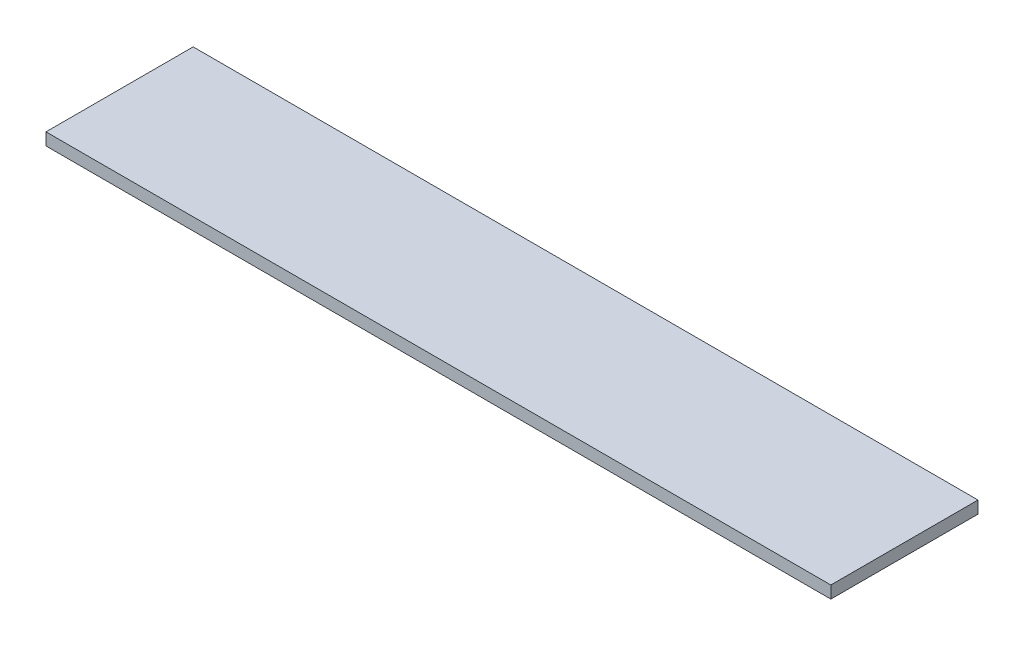
ISO-10303-21;
HEADER;
FILE_DESCRIPTION(('STEP AP214'),'2;1');
FILE_NAME('part.step','',(''),(''),'','','');
FILE_SCHEMA(('AUTOMOTIVE_DESIGN { 1 0 10303 214 1 1 1 1 }'));
ENDSEC;
DATA;
#1=APPLICATION_CONTEXT('core data for automotive mechanical design processes');
#2=APPLICATION_PROTOCOL_DEFINITION('international standard','automotive_design',2000,#1);
#3=PRODUCT_CONTEXT('',#1,'mechanical');
#4=PRODUCT('Part','Part','',(#3));
#5=PRODUCT_RELATED_PRODUCT_CATEGORY('part','',(#4));
#6=PRODUCT_DEFINITION_FORMATION('','',#4);
#7=PRODUCT_DEFINITION_CONTEXT('part definition',#1,'design');
#8=PRODUCT_DEFINITION('design','',#6,#7);
#9=PRODUCT_DEFINITION_SHAPE('','',#8);
#10=(LENGTH_UNIT() NAMED_UNIT(*) SI_UNIT(.MILLI.,.METRE.));
#11=(NAMED_UNIT(*) PLANE_ANGLE_UNIT() SI_UNIT($,.RADIAN.));
#12=(NAMED_UNIT(*) SI_UNIT($,.STERADIAN.) SOLID_ANGLE_UNIT());
#13=UNCERTAINTY_MEASURE_WITH_UNIT(LENGTH_MEASURE(1.E-05),#10,'distance_accuracy_value','');
#14=(GEOMETRIC_REPRESENTATION_CONTEXT(3) GLOBAL_UNCERTAINTY_ASSIGNED_CONTEXT((#13)) GLOBAL_UNIT_ASSIGNED_CONTEXT((#10,
#11,#12)) REPRESENTATION_CONTEXT('',''));
#15=CARTESIAN_POINT('',(0.,0.,0.));
#16=DIRECTION('',(0.,0.,1.));
#17=DIRECTION('',(1.,0.,0.));
#18=AXIS2_PLACEMENT_3D('',#15,#16,#17);
#19=CARTESIAN_POINT('',(0.,5.,0.));
#20=DIRECTION('',(1.,0.,0.));
#21=DIRECTION('',(0.,0.,-1.));
#22=AXIS2_PLACEMENT_3D('',#19,#20,#21);
#23=PLANE('',#22);
#24=DIRECTION('',(0.,0.,1.));
#25=VECTOR('',#24,1.);
#26=CARTESIAN_POINT('',(0.,0.,0.));
#27=LINE('',#26,#25);
#28=CARTESIAN_POINT('',(0.,0.,0.));
#29=VERTEX_POINT('',#28);
#30=CARTESIAN_POINT('',(0.,0.,60.));
#31=VERTEX_POINT('',#30);
#32=EDGE_CURVE('E111',#29,#31,#27,.T.);
#33=ORIENTED_EDGE('',*,*,#32,.T.);
#34=DIRECTION('',(0.,-1.,0.));
#35=VECTOR('',#34,1.);
#36=CARTESIAN_POINT('',(0.,5.,60.));
#37=LINE('',#36,#35);
#38=CARTESIAN_POINT('',(0.,5.,60.));
#39=VERTEX_POINT('',#38);
#40=EDGE_CURVE('E11',#39,#31,#37,.T.);
#41=ORIENTED_EDGE('',*,*,#40,.F.);
#42=DIRECTION('',(0.,0.,1.));
#43=VECTOR('',#42,1.);
#44=CARTESIAN_POINT('',(0.,5.,0.));
#45=LINE('',#44,#43);
#46=CARTESIAN_POINT('',(0.,5.,0.));
#47=VERTEX_POINT('',#46);
#48=EDGE_CURVE('E95',#47,#39,#45,.T.);
#49=ORIENTED_EDGE('',*,*,#48,.F.);
#50=DIRECTION('',(0.,-1.,0.));
#51=VECTOR('',#50,1.);
#52=CARTESIAN_POINT('',(0.,5.,0.));
#53=LINE('',#52,#51);
#54=EDGE_CURVE('E107',#47,#29,#53,.T.);
#55=ORIENTED_EDGE('',*,*,#54,.T.);
#56=EDGE_LOOP('',(#33,#41,#49,#55));
#57=FACE_BOUND('',#56,.T.);
#58=ADVANCED_FACE('F43',(#57),#23,.F.);
#59=CARTESIAN_POINT('',(0.,5.,60.));
#60=DIRECTION('',(0.,0.,-1.));
#61=DIRECTION('',(-1.,0.,0.));
#62=AXIS2_PLACEMENT_3D('',#59,#60,#61);
#63=PLANE('',#62);
#64=DIRECTION('',(1.,0.,0.));
#65=VECTOR('',#64,1.);
#66=CARTESIAN_POINT('',(0.,0.,60.));
#67=LINE('',#66,#65);
#68=CARTESIAN_POINT('',(320.,0.,60.));
#69=VERTEX_POINT('',#68);
#70=EDGE_CURVE('E100',#31,#69,#67,.T.);
#71=ORIENTED_EDGE('',*,*,#70,.T.);
#72=DIRECTION('',(0.,-1.,0.));
#73=VECTOR('',#72,1.);
#74=CARTESIAN_POINT('',(320.,5.,60.));
#75=LINE('',#74,#73);
#76=CARTESIAN_POINT('',(320.,5.,60.));
#77=VERTEX_POINT('',#76);
#78=EDGE_CURVE('E52',#77,#69,#75,.T.);
#79=ORIENTED_EDGE('',*,*,#78,.F.);
#80=DIRECTION('',(1.,0.,0.));
#81=VECTOR('',#80,1.);
#82=CARTESIAN_POINT('',(0.,5.,60.));
#83=LINE('',#82,#81);
#84=EDGE_CURVE('E90',#39,#77,#83,.T.);
#85=ORIENTED_EDGE('',*,*,#84,.F.);
#86=ORIENTED_EDGE('',*,*,#40,.T.);
#87=EDGE_LOOP('',(#71,#79,#85,#86));
#88=FACE_BOUND('',#87,.T.);
#89=ADVANCED_FACE('F99',(#88),#63,.F.);
#90=CARTESIAN_POINT('',(320.,5.,0.));
#91=DIRECTION('',(-1.,0.,0.));
#92=DIRECTION('',(0.,0.,1.));
#93=AXIS2_PLACEMENT_3D('',#90,#91,#92);
#94=PLANE('',#93);
#95=DIRECTION('',(0.,0.,-1.));
#96=VECTOR('',#95,1.);
#97=CARTESIAN_POINT('',(320.,0.,0.));
#98=LINE('',#97,#96);
#99=CARTESIAN_POINT('',(320.,0.,0.));
#100=VERTEX_POINT('',#99);
#101=EDGE_CURVE('E77',#69,#100,#98,.T.);
#102=ORIENTED_EDGE('',*,*,#101,.T.);
#103=DIRECTION('',(0.,-1.,0.));
#104=VECTOR('',#103,1.);
#105=CARTESIAN_POINT('',(320.,5.,0.));
#106=LINE('',#105,#104);
#107=CARTESIAN_POINT('',(320.,5.,0.));
#108=VERTEX_POINT('',#107);
#109=EDGE_CURVE('E102',#108,#100,#106,.T.);
#110=ORIENTED_EDGE('',*,*,#109,.F.);
#111=DIRECTION('',(0.,0.,-1.));
#112=VECTOR('',#111,1.);
#113=CARTESIAN_POINT('',(320.,5.,0.));
#114=LINE('',#113,#112);
#115=EDGE_CURVE('E93',#77,#108,#114,.T.);
#116=ORIENTED_EDGE('',*,*,#115,.F.);
#117=ORIENTED_EDGE('',*,*,#78,.T.);
#118=EDGE_LOOP('',(#102,#110,#116,#117));
#119=FACE_BOUND('',#118,.T.);
#120=ADVANCED_FACE('F103',(#119),#94,.F.);
#121=CARTESIAN_POINT('',(0.,5.,0.));
#122=DIRECTION('',(0.,0.,1.));
#123=DIRECTION('',(1.,0.,0.));
#124=AXIS2_PLACEMENT_3D('',#121,#122,#123);
#125=PLANE('',#124);
#126=DIRECTION('',(-1.,0.,0.));
#127=VECTOR('',#126,1.);
#128=CARTESIAN_POINT('',(0.,0.,0.));
#129=LINE('',#128,#127);
#130=EDGE_CURVE('E83',#100,#29,#129,.T.);
#131=ORIENTED_EDGE('',*,*,#130,.T.);
#132=ORIENTED_EDGE('',*,*,#54,.F.);
#133=DIRECTION('',(-1.,0.,0.));
#134=VECTOR('',#133,1.);
#135=CARTESIAN_POINT('',(0.,5.,0.));
#136=LINE('',#135,#134);
#137=EDGE_CURVE('E60',#108,#47,#136,.T.);
#138=ORIENTED_EDGE('',*,*,#137,.F.);
#139=ORIENTED_EDGE('',*,*,#109,.T.);
#140=EDGE_LOOP('',(#131,#132,#138,#139));
#141=FACE_BOUND('',#140,.T.);
#142=ADVANCED_FACE('F124',(#141),#125,.F.);
#143=CARTESIAN_POINT('',(0.,5.,0.));
#144=DIRECTION('',(0.,1.,0.));
#145=DIRECTION('',(0.,0.,1.));
#146=AXIS2_PLACEMENT_3D('',#143,#144,#145);
#147=PLANE('',#146);
#148=ORIENTED_EDGE('',*,*,#48,.T.);
#149=ORIENTED_EDGE('',*,*,#84,.T.);
#150=ORIENTED_EDGE('',*,*,#115,.T.);
#151=ORIENTED_EDGE('',*,*,#137,.T.);
#152=EDGE_LOOP('',(#148,#149,#150,#151));
#153=FACE_BOUND('',#152,.T.);
#154=ADVANCED_FACE('F91',(#153),#147,.T.);
#155=CARTESIAN_POINT('',(0.,0.,0.));
#156=DIRECTION('',(0.,1.,0.));
#157=DIRECTION('',(0.,0.,1.));
#158=AXIS2_PLACEMENT_3D('',#155,#156,#157);
#159=PLANE('',#158);
#160=ORIENTED_EDGE('',*,*,#32,.F.);
#161=ORIENTED_EDGE('',*,*,#130,.F.);
#162=ORIENTED_EDGE('',*,*,#101,.F.);
#163=ORIENTED_EDGE('',*,*,#70,.F.);
#164=EDGE_LOOP('',(#160,#161,#162,#163));
#165=FACE_BOUND('',#164,.T.);
#166=ADVANCED_FACE('F127',(#165),#159,.F.);
#167=CLOSED_SHELL('',(#58,#89,#120,#142,#154,#166));
#168=MANIFOLD_SOLID_BREP('B2',#167);
#169=ADVANCED_BREP_SHAPE_REPRESENTATION('',(#18,#168),#14);
#170=SHAPE_DEFINITION_REPRESENTATION(#9,#169);
ENDSEC;
END-ISO-10303-21;
